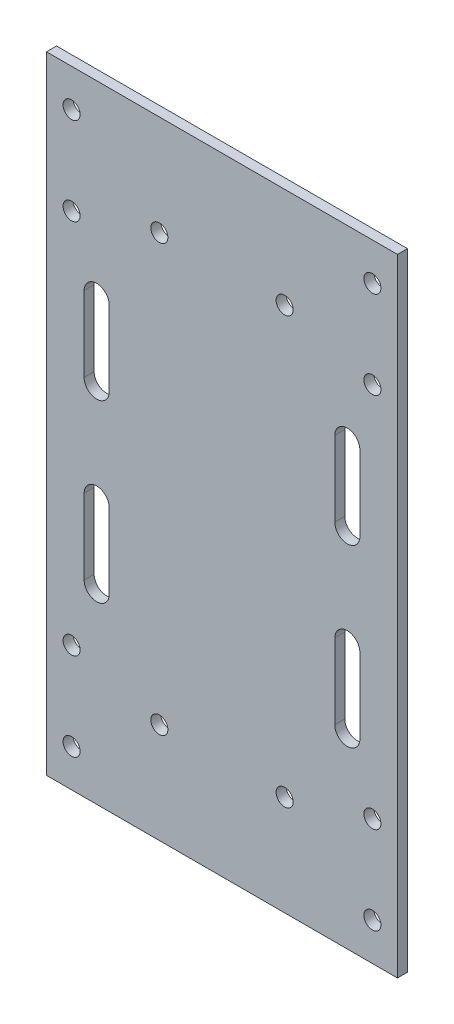
ISO-10303-21;
HEADER;
FILE_DESCRIPTION(('STEP AP214'),'2;1');
FILE_NAME('part.step','',(''),(''),'','','');
FILE_SCHEMA(('AUTOMOTIVE_DESIGN { 1 0 10303 214 1 1 1 1 }'));
ENDSEC;
DATA;
#1=APPLICATION_CONTEXT('core data for automotive mechanical design processes');
#2=APPLICATION_PROTOCOL_DEFINITION('international standard','automotive_design',2000,#1);
#3=PRODUCT_CONTEXT('',#1,'mechanical');
#4=PRODUCT('Part','Part','',(#3));
#5=PRODUCT_RELATED_PRODUCT_CATEGORY('part','',(#4));
#6=PRODUCT_DEFINITION_FORMATION('','',#4);
#7=PRODUCT_DEFINITION_CONTEXT('part definition',#1,'design');
#8=PRODUCT_DEFINITION('design','',#6,#7);
#9=PRODUCT_DEFINITION_SHAPE('','',#8);
#10=(LENGTH_UNIT() NAMED_UNIT(*) SI_UNIT(.MILLI.,.METRE.));
#11=(NAMED_UNIT(*) PLANE_ANGLE_UNIT() SI_UNIT($,.RADIAN.));
#12=(NAMED_UNIT(*) SI_UNIT($,.STERADIAN.) SOLID_ANGLE_UNIT());
#13=UNCERTAINTY_MEASURE_WITH_UNIT(LENGTH_MEASURE(1.E-05),#10,'distance_accuracy_value','');
#14=(GEOMETRIC_REPRESENTATION_CONTEXT(3) GLOBAL_UNCERTAINTY_ASSIGNED_CONTEXT((#13)) GLOBAL_UNIT_ASSIGNED_CONTEXT((#10,
#11,#12)) REPRESENTATION_CONTEXT('',''));
#15=CARTESIAN_POINT('',(0.,0.,0.));
#16=DIRECTION('',(0.,0.,1.));
#17=DIRECTION('',(1.,0.,0.));
#18=AXIS2_PLACEMENT_3D('',#15,#16,#17);
#19=CARTESIAN_POINT('',(0.,0.,0.));
#20=DIRECTION('',(0.,0.,-1.));
#21=DIRECTION('',(-1.,0.,0.));
#22=AXIS2_PLACEMENT_3D('',#19,#20,#21);
#23=PLANE('',#22);
#24=CARTESIAN_POINT('',(25.,-25.,0.));
#25=DIRECTION('',(0.,0.,-1.));
#26=DIRECTION('',(-1.,0.,0.));
#27=AXIS2_PLACEMENT_3D('',#24,#25,#26);
#28=CIRCLE('',#27,2.5);
#29=CARTESIAN_POINT('',(22.5,-25.,0.));
#30=VERTEX_POINT('',#29);
#31=CARTESIAN_POINT('',(27.5,-25.,0.));
#32=VERTEX_POINT('',#31);
#33=EDGE_CURVE('E557',#30,#32,#28,.F.);
#34=ORIENTED_EDGE('',*,*,#33,.F.);
#35=DIRECTION('',(0.,-1.,0.));
#36=VECTOR('',#35,1.);
#37=CARTESIAN_POINT('',(22.5,0.,0.));
#38=LINE('',#37,#36);
#39=CARTESIAN_POINT('',(22.5,-10.,0.));
#40=VERTEX_POINT('',#39);
#41=EDGE_CURVE('E261',#40,#30,#38,.T.);
#42=ORIENTED_EDGE('',*,*,#41,.F.);
#43=CARTESIAN_POINT('',(25.,-10.,0.));
#44=DIRECTION('',(0.,0.,-1.));
#45=DIRECTION('',(-1.,0.,0.));
#46=AXIS2_PLACEMENT_3D('',#43,#44,#45);
#47=CIRCLE('',#46,2.5);
#48=CARTESIAN_POINT('',(27.5,-10.,0.));
#49=VERTEX_POINT('',#48);
#50=EDGE_CURVE('E564',#49,#40,#47,.F.);
#51=ORIENTED_EDGE('',*,*,#50,.F.);
#52=DIRECTION('',(0.,1.,0.));
#53=VECTOR('',#52,1.);
#54=CARTESIAN_POINT('',(27.5,0.,0.));
#55=LINE('',#54,#53);
#56=EDGE_CURVE('E263',#32,#49,#55,.T.);
#57=ORIENTED_EDGE('',*,*,#56,.F.);
#58=EDGE_LOOP('',(#34,#42,#51,#57));
#59=FACE_BOUND('',#58,.T.);
#60=CARTESIAN_POINT('',(-25.,25.,0.));
#61=DIRECTION('',(0.,0.,-1.));
#62=DIRECTION('',(-1.,0.,0.));
#63=AXIS2_PLACEMENT_3D('',#60,#61,#62);
#64=CIRCLE('',#63,2.5);
#65=CARTESIAN_POINT('',(-22.5,25.,0.));
#66=VERTEX_POINT('',#65);
#67=CARTESIAN_POINT('',(-27.5,25.,0.));
#68=VERTEX_POINT('',#67);
#69=EDGE_CURVE('E566',#66,#68,#64,.F.);
#70=ORIENTED_EDGE('',*,*,#69,.F.);
#71=DIRECTION('',(0.,1.,0.));
#72=VECTOR('',#71,1.);
#73=CARTESIAN_POINT('',(-22.5,0.,0.));
#74=LINE('',#73,#72);
#75=CARTESIAN_POINT('',(-22.5,10.,0.));
#76=VERTEX_POINT('',#75);
#77=EDGE_CURVE('E268',#76,#66,#74,.T.);
#78=ORIENTED_EDGE('',*,*,#77,.F.);
#79=CARTESIAN_POINT('',(-25.,10.,0.));
#80=DIRECTION('',(0.,0.,-1.));
#81=DIRECTION('',(-1.,0.,0.));
#82=AXIS2_PLACEMENT_3D('',#79,#80,#81);
#83=CIRCLE('',#82,2.5);
#84=CARTESIAN_POINT('',(-27.5,10.,0.));
#85=VERTEX_POINT('',#84);
#86=EDGE_CURVE('E195',#85,#76,#83,.F.);
#87=ORIENTED_EDGE('',*,*,#86,.F.);
#88=DIRECTION('',(0.,-1.,0.));
#89=VECTOR('',#88,1.);
#90=CARTESIAN_POINT('',(-27.5,0.,0.));
#91=LINE('',#90,#89);
#92=EDGE_CURVE('E269',#68,#85,#91,.T.);
#93=ORIENTED_EDGE('',*,*,#92,.F.);
#94=EDGE_LOOP('',(#70,#78,#87,#93));
#95=FACE_BOUND('',#94,.T.);
#96=CARTESIAN_POINT('',(-25.,-10.,0.));
#97=DIRECTION('',(0.,0.,-1.));
#98=DIRECTION('',(-1.,0.,0.));
#99=AXIS2_PLACEMENT_3D('',#96,#97,#98);
#100=CIRCLE('',#99,2.5);
#101=CARTESIAN_POINT('',(-22.5,-10.,0.));
#102=VERTEX_POINT('',#101);
#103=CARTESIAN_POINT('',(-27.5,-10.,0.));
#104=VERTEX_POINT('',#103);
#105=EDGE_CURVE('E579',#102,#104,#100,.F.);
#106=ORIENTED_EDGE('',*,*,#105,.F.);
#107=DIRECTION('',(0.,1.,0.));
#108=VECTOR('',#107,1.);
#109=CARTESIAN_POINT('',(-22.5,0.,0.));
#110=LINE('',#109,#108);
#111=CARTESIAN_POINT('',(-22.5,-25.,0.));
#112=VERTEX_POINT('',#111);
#113=EDGE_CURVE('E255',#112,#102,#110,.T.);
#114=ORIENTED_EDGE('',*,*,#113,.F.);
#115=CARTESIAN_POINT('',(-25.,-25.,0.));
#116=DIRECTION('',(0.,0.,-1.));
#117=DIRECTION('',(-1.,0.,0.));
#118=AXIS2_PLACEMENT_3D('',#115,#116,#117);
#119=CIRCLE('',#118,2.5);
#120=CARTESIAN_POINT('',(-27.5,-25.,0.));
#121=VERTEX_POINT('',#120);
#122=EDGE_CURVE('E577',#121,#112,#119,.F.);
#123=ORIENTED_EDGE('',*,*,#122,.F.);
#124=DIRECTION('',(0.,-1.,0.));
#125=VECTOR('',#124,1.);
#126=CARTESIAN_POINT('',(-27.5,0.,0.));
#127=LINE('',#126,#125);
#128=EDGE_CURVE('E248',#104,#121,#127,.T.);
#129=ORIENTED_EDGE('',*,*,#128,.F.);
#130=EDGE_LOOP('',(#106,#114,#123,#129));
#131=FACE_BOUND('',#130,.T.);
#132=CARTESIAN_POINT('',(25.,10.,0.));
#133=DIRECTION('',(0.,0.,-1.));
#134=DIRECTION('',(-1.,0.,0.));
#135=AXIS2_PLACEMENT_3D('',#132,#133,#134);
#136=CIRCLE('',#135,2.5);
#137=CARTESIAN_POINT('',(22.5,10.,0.));
#138=VERTEX_POINT('',#137);
#139=CARTESIAN_POINT('',(27.5,10.,0.));
#140=VERTEX_POINT('',#139);
#141=EDGE_CURVE('E568',#138,#140,#136,.F.);
#142=ORIENTED_EDGE('',*,*,#141,.F.);
#143=DIRECTION('',(0.,-1.,0.));
#144=VECTOR('',#143,1.);
#145=CARTESIAN_POINT('',(22.5,0.,0.));
#146=LINE('',#145,#144);
#147=CARTESIAN_POINT('',(22.5,25.,0.));
#148=VERTEX_POINT('',#147);
#149=EDGE_CURVE('E253',#148,#138,#146,.T.);
#150=ORIENTED_EDGE('',*,*,#149,.F.);
#151=CARTESIAN_POINT('',(25.,25.,0.));
#152=DIRECTION('',(0.,0.,-1.));
#153=DIRECTION('',(-1.,0.,0.));
#154=AXIS2_PLACEMENT_3D('',#151,#152,#153);
#155=CIRCLE('',#154,2.5);
#156=CARTESIAN_POINT('',(27.5,25.,0.));
#157=VERTEX_POINT('',#156);
#158=EDGE_CURVE('E573',#157,#148,#155,.F.);
#159=ORIENTED_EDGE('',*,*,#158,.F.);
#160=DIRECTION('',(0.,1.,0.));
#161=VECTOR('',#160,1.);
#162=CARTESIAN_POINT('',(27.5,0.,0.));
#163=LINE('',#162,#161);
#164=EDGE_CURVE('E259',#140,#157,#163,.T.);
#165=ORIENTED_EDGE('',*,*,#164,.F.);
#166=EDGE_LOOP('',(#142,#150,#159,#165));
#167=FACE_BOUND('',#166,.T.);
#168=DIRECTION('',(0.,1.,0.));
#169=VECTOR('',#168,1.);
#170=CARTESIAN_POINT('',(35.,-62.5,0.));
#171=LINE('',#170,#169);
#172=CARTESIAN_POINT('',(35.,-62.5,0.));
#173=VERTEX_POINT('',#172);
#174=CARTESIAN_POINT('',(35.,62.5,0.));
#175=VERTEX_POINT('',#174);
#176=EDGE_CURVE('E962',#173,#175,#171,.T.);
#177=ORIENTED_EDGE('',*,*,#176,.T.);
#178=DIRECTION('',(-1.,0.,0.));
#179=VECTOR('',#178,1.);
#180=CARTESIAN_POINT('',(-35.,62.5,0.));
#181=LINE('',#180,#179);
#182=CARTESIAN_POINT('',(-35.,62.5,0.));
#183=VERTEX_POINT('',#182);
#184=EDGE_CURVE('E967',#175,#183,#181,.T.);
#185=ORIENTED_EDGE('',*,*,#184,.T.);
#186=DIRECTION('',(0.,-1.,0.));
#187=VECTOR('',#186,1.);
#188=CARTESIAN_POINT('',(-35.,-62.5,0.));
#189=LINE('',#188,#187);
#190=CARTESIAN_POINT('',(-35.,-62.5,0.));
#191=VERTEX_POINT('',#190);
#192=EDGE_CURVE('E968',#183,#191,#189,.T.);
#193=ORIENTED_EDGE('',*,*,#192,.T.);
#194=DIRECTION('',(1.,0.,0.));
#195=VECTOR('',#194,1.);
#196=CARTESIAN_POINT('',(-35.,-62.5,0.));
#197=LINE('',#196,#195);
#198=EDGE_CURVE('E969',#191,#173,#197,.T.);
#199=ORIENTED_EDGE('',*,*,#198,.T.);
#200=EDGE_LOOP('',(#177,#185,#193,#199));
#201=FACE_BOUND('',#200,.T.);
#202=CARTESIAN_POINT('',(-30.,-55.,1.2E-05));
#203=DIRECTION('',(0.,0.,1.));
#204=DIRECTION('',(1.,0.,0.));
#205=AXIS2_PLACEMENT_3D('',#202,#203,#204);
#206=CIRCLE('',#205,1.7);
#207=CARTESIAN_POINT('',(-28.3,-55.,1.2E-05));
#208=VERTEX_POINT('',#207);
#209=EDGE_CURVE('E316',#208,#208,#206,.T.);
#210=ORIENTED_EDGE('',*,*,#209,.F.);
#211=EDGE_LOOP('',(#210));
#212=FACE_BOUND('',#211,.T.);
#213=CARTESIAN_POINT('',(-12.5,42.5,1.2E-05));
#214=DIRECTION('',(0.,0.,1.));
#215=DIRECTION('',(1.,0.,0.));
#216=AXIS2_PLACEMENT_3D('',#213,#214,#215);
#217=CIRCLE('',#216,1.7);
#218=CARTESIAN_POINT('',(-10.8,42.5,1.2E-05));
#219=VERTEX_POINT('',#218);
#220=EDGE_CURVE('E281',#219,#219,#217,.T.);
#221=ORIENTED_EDGE('',*,*,#220,.F.);
#222=EDGE_LOOP('',(#221));
#223=FACE_BOUND('',#222,.T.);
#224=CARTESIAN_POINT('',(12.5,-42.5,1.2E-05));
#225=DIRECTION('',(0.,0.,1.));
#226=DIRECTION('',(1.,0.,0.));
#227=AXIS2_PLACEMENT_3D('',#224,#225,#226);
#228=CIRCLE('',#227,1.7);
#229=CARTESIAN_POINT('',(14.2,-42.5,1.2E-05));
#230=VERTEX_POINT('',#229);
#231=EDGE_CURVE('E277',#230,#230,#228,.T.);
#232=ORIENTED_EDGE('',*,*,#231,.F.);
#233=EDGE_LOOP('',(#232));
#234=FACE_BOUND('',#233,.T.);
#235=CARTESIAN_POINT('',(12.5,42.5,1.2E-05));
#236=DIRECTION('',(0.,0.,1.));
#237=DIRECTION('',(1.,0.,0.));
#238=AXIS2_PLACEMENT_3D('',#235,#236,#237);
#239=CIRCLE('',#238,1.7);
#240=CARTESIAN_POINT('',(14.2,42.5,1.2E-05));
#241=VERTEX_POINT('',#240);
#242=EDGE_CURVE('E275',#241,#241,#239,.T.);
#243=ORIENTED_EDGE('',*,*,#242,.F.);
#244=EDGE_LOOP('',(#243));
#245=FACE_BOUND('',#244,.T.);
#246=CARTESIAN_POINT('',(30.,-55.,1.2E-05));
#247=DIRECTION('',(0.,0.,1.));
#248=DIRECTION('',(1.,0.,0.));
#249=AXIS2_PLACEMENT_3D('',#246,#247,#248);
#250=CIRCLE('',#249,1.7);
#251=CARTESIAN_POINT('',(31.7,-55.,1.2E-05));
#252=VERTEX_POINT('',#251);
#253=EDGE_CURVE('E298',#252,#252,#250,.T.);
#254=ORIENTED_EDGE('',*,*,#253,.F.);
#255=EDGE_LOOP('',(#254));
#256=FACE_BOUND('',#255,.T.);
#257=CARTESIAN_POINT('',(-30.,55.,1.2E-05));
#258=DIRECTION('',(0.,0.,1.));
#259=DIRECTION('',(1.,0.,0.));
#260=AXIS2_PLACEMENT_3D('',#257,#258,#259);
#261=CIRCLE('',#260,1.7);
#262=CARTESIAN_POINT('',(-28.3,55.,1.2E-05));
#263=VERTEX_POINT('',#262);
#264=EDGE_CURVE('E304',#263,#263,#261,.T.);
#265=ORIENTED_EDGE('',*,*,#264,.F.);
#266=EDGE_LOOP('',(#265));
#267=FACE_BOUND('',#266,.T.);
#268=CARTESIAN_POINT('',(-30.,37.5,1.2E-05));
#269=DIRECTION('',(0.,0.,1.));
#270=DIRECTION('',(1.,0.,0.));
#271=AXIS2_PLACEMENT_3D('',#268,#269,#270);
#272=CIRCLE('',#271,1.7);
#273=CARTESIAN_POINT('',(-28.3,37.5,1.2E-05));
#274=VERTEX_POINT('',#273);
#275=EDGE_CURVE('E302',#274,#274,#272,.T.);
#276=ORIENTED_EDGE('',*,*,#275,.F.);
#277=EDGE_LOOP('',(#276));
#278=FACE_BOUND('',#277,.T.);
#279=CARTESIAN_POINT('',(-30.,-37.5,1.2E-05));
#280=DIRECTION('',(0.,0.,1.));
#281=DIRECTION('',(1.,0.,0.));
#282=AXIS2_PLACEMENT_3D('',#279,#280,#281);
#283=CIRCLE('',#282,1.7);
#284=CARTESIAN_POINT('',(-28.3,-37.5,1.2E-05));
#285=VERTEX_POINT('',#284);
#286=EDGE_CURVE('E312',#285,#285,#283,.T.);
#287=ORIENTED_EDGE('',*,*,#286,.F.);
#288=EDGE_LOOP('',(#287));
#289=FACE_BOUND('',#288,.T.);
#290=CARTESIAN_POINT('',(-12.5,-42.5,1.2E-05));
#291=DIRECTION('',(0.,0.,1.));
#292=DIRECTION('',(1.,0.,0.));
#293=AXIS2_PLACEMENT_3D('',#290,#291,#292);
#294=CIRCLE('',#293,1.7);
#295=CARTESIAN_POINT('',(-10.8,-42.5,1.2E-05));
#296=VERTEX_POINT('',#295);
#297=EDGE_CURVE('E278',#296,#296,#294,.T.);
#298=ORIENTED_EDGE('',*,*,#297,.F.);
#299=EDGE_LOOP('',(#298));
#300=FACE_BOUND('',#299,.T.);
#301=CARTESIAN_POINT('',(30.,55.,1.2E-05));
#302=DIRECTION('',(0.,0.,1.));
#303=DIRECTION('',(1.,0.,0.));
#304=AXIS2_PLACEMENT_3D('',#301,#302,#303);
#305=CIRCLE('',#304,1.7);
#306=CARTESIAN_POINT('',(31.7,55.,1.2E-05));
#307=VERTEX_POINT('',#306);
#308=EDGE_CURVE('E286',#307,#307,#305,.T.);
#309=ORIENTED_EDGE('',*,*,#308,.F.);
#310=EDGE_LOOP('',(#309));
#311=FACE_BOUND('',#310,.T.);
#312=CARTESIAN_POINT('',(30.,37.5,1.2E-05));
#313=DIRECTION('',(0.,0.,1.));
#314=DIRECTION('',(1.,0.,0.));
#315=AXIS2_PLACEMENT_3D('',#312,#313,#314);
#316=CIRCLE('',#315,1.7);
#317=CARTESIAN_POINT('',(31.7,37.5,1.2E-05));
#318=VERTEX_POINT('',#317);
#319=EDGE_CURVE('E290',#318,#318,#316,.T.);
#320=ORIENTED_EDGE('',*,*,#319,.F.);
#321=EDGE_LOOP('',(#320));
#322=FACE_BOUND('',#321,.T.);
#323=CARTESIAN_POINT('',(30.,-37.5,1.2E-05));
#324=DIRECTION('',(0.,0.,1.));
#325=DIRECTION('',(1.,0.,0.));
#326=AXIS2_PLACEMENT_3D('',#323,#324,#325);
#327=CIRCLE('',#326,1.7);
#328=CARTESIAN_POINT('',(31.7,-37.5,1.2E-05));
#329=VERTEX_POINT('',#328);
#330=EDGE_CURVE('E300',#329,#329,#327,.T.);
#331=ORIENTED_EDGE('',*,*,#330,.F.);
#332=EDGE_LOOP('',(#331));
#333=FACE_BOUND('',#332,.T.);
#334=ADVANCED_FACE('F39',(#59,#95,#131,#167,#201,#212,#223,#234,#245,#256,#267,#278,#289,#300,
#311,#322,#333),#23,.F.);
#335=CARTESIAN_POINT('',(0.,0.,-2.));
#336=DIRECTION('',(0.,0.,-1.));
#337=DIRECTION('',(-1.,0.,0.));
#338=AXIS2_PLACEMENT_3D('',#335,#336,#337);
#339=PLANE('',#338);
#340=CARTESIAN_POINT('',(30.,-37.5,-2.));
#341=DIRECTION('',(0.,0.,1.));
#342=DIRECTION('',(1.,0.,0.));
#343=AXIS2_PLACEMENT_3D('',#340,#341,#342);
#344=CIRCLE('',#343,1.7);
#345=CARTESIAN_POINT('',(31.7,-37.5,-2.));
#346=VERTEX_POINT('',#345);
#347=EDGE_CURVE('E291',#346,#346,#344,.T.);
#348=ORIENTED_EDGE('',*,*,#347,.T.);
#349=EDGE_LOOP('',(#348));
#350=FACE_BOUND('',#349,.T.);
#351=CARTESIAN_POINT('',(30.,37.5,-2.));
#352=DIRECTION('',(0.,0.,1.));
#353=DIRECTION('',(1.,0.,0.));
#354=AXIS2_PLACEMENT_3D('',#351,#352,#353);
#355=CIRCLE('',#354,1.7);
#356=CARTESIAN_POINT('',(31.7,37.5,-2.));
#357=VERTEX_POINT('',#356);
#358=EDGE_CURVE('E296',#357,#357,#355,.T.);
#359=ORIENTED_EDGE('',*,*,#358,.T.);
#360=EDGE_LOOP('',(#359));
#361=FACE_BOUND('',#360,.T.);
#362=CARTESIAN_POINT('',(30.,55.,-2.));
#363=DIRECTION('',(0.,0.,1.));
#364=DIRECTION('',(1.,0.,0.));
#365=AXIS2_PLACEMENT_3D('',#362,#363,#364);
#366=CIRCLE('',#365,1.7);
#367=CARTESIAN_POINT('',(31.7,55.,-2.));
#368=VERTEX_POINT('',#367);
#369=EDGE_CURVE('E285',#368,#368,#366,.T.);
#370=ORIENTED_EDGE('',*,*,#369,.T.);
#371=EDGE_LOOP('',(#370));
#372=FACE_BOUND('',#371,.T.);
#373=CARTESIAN_POINT('',(-12.5,-42.5,-2.));
#374=DIRECTION('',(0.,0.,1.));
#375=DIRECTION('',(1.,0.,0.));
#376=AXIS2_PLACEMENT_3D('',#373,#374,#375);
#377=CIRCLE('',#376,1.7);
#378=CARTESIAN_POINT('',(-10.8,-42.5,-2.));
#379=VERTEX_POINT('',#378);
#380=EDGE_CURVE('E288',#379,#379,#377,.T.);
#381=ORIENTED_EDGE('',*,*,#380,.T.);
#382=EDGE_LOOP('',(#381));
#383=FACE_BOUND('',#382,.T.);
#384=CARTESIAN_POINT('',(-30.,-37.5,-2.));
#385=DIRECTION('',(0.,0.,1.));
#386=DIRECTION('',(1.,0.,0.));
#387=AXIS2_PLACEMENT_3D('',#384,#385,#386);
#388=CIRCLE('',#387,1.7);
#389=CARTESIAN_POINT('',(-28.3,-37.5,-2.));
#390=VERTEX_POINT('',#389);
#391=EDGE_CURVE('E307',#390,#390,#388,.T.);
#392=ORIENTED_EDGE('',*,*,#391,.T.);
#393=EDGE_LOOP('',(#392));
#394=FACE_BOUND('',#393,.T.);
#395=CARTESIAN_POINT('',(-30.,37.5,-2.));
#396=DIRECTION('',(0.,0.,1.));
#397=DIRECTION('',(1.,0.,0.));
#398=AXIS2_PLACEMENT_3D('',#395,#396,#397);
#399=CIRCLE('',#398,1.7);
#400=CARTESIAN_POINT('',(-28.3,37.5,-2.));
#401=VERTEX_POINT('',#400);
#402=EDGE_CURVE('E313',#401,#401,#399,.T.);
#403=ORIENTED_EDGE('',*,*,#402,.T.);
#404=EDGE_LOOP('',(#403));
#405=FACE_BOUND('',#404,.T.);
#406=CARTESIAN_POINT('',(-30.,55.,-2.));
#407=DIRECTION('',(0.,0.,1.));
#408=DIRECTION('',(1.,0.,0.));
#409=AXIS2_PLACEMENT_3D('',#406,#407,#408);
#410=CIRCLE('',#409,1.7);
#411=CARTESIAN_POINT('',(-28.3,55.,-2.));
#412=VERTEX_POINT('',#411);
#413=EDGE_CURVE('E301',#412,#412,#410,.T.);
#414=ORIENTED_EDGE('',*,*,#413,.T.);
#415=EDGE_LOOP('',(#414));
#416=FACE_BOUND('',#415,.T.);
#417=CARTESIAN_POINT('',(30.,-55.,-2.));
#418=DIRECTION('',(0.,0.,1.));
#419=DIRECTION('',(1.,0.,0.));
#420=AXIS2_PLACEMENT_3D('',#417,#418,#419);
#421=CIRCLE('',#420,1.7);
#422=CARTESIAN_POINT('',(31.7,-55.,-2.));
#423=VERTEX_POINT('',#422);
#424=EDGE_CURVE('E306',#423,#423,#421,.T.);
#425=ORIENTED_EDGE('',*,*,#424,.T.);
#426=EDGE_LOOP('',(#425));
#427=FACE_BOUND('',#426,.T.);
#428=CARTESIAN_POINT('',(12.5,42.5,-2.));
#429=DIRECTION('',(0.,0.,1.));
#430=DIRECTION('',(1.,0.,0.));
#431=AXIS2_PLACEMENT_3D('',#428,#429,#430);
#432=CIRCLE('',#431,1.7);
#433=CARTESIAN_POINT('',(14.2,42.5,-2.));
#434=VERTEX_POINT('',#433);
#435=EDGE_CURVE('E271',#434,#434,#432,.T.);
#436=ORIENTED_EDGE('',*,*,#435,.T.);
#437=EDGE_LOOP('',(#436));
#438=FACE_BOUND('',#437,.T.);
#439=CARTESIAN_POINT('',(12.5,-42.5,-2.));
#440=DIRECTION('',(0.,0.,1.));
#441=DIRECTION('',(1.,0.,0.));
#442=AXIS2_PLACEMENT_3D('',#439,#440,#441);
#443=CIRCLE('',#442,1.7);
#444=CARTESIAN_POINT('',(14.2,-42.5,-2.));
#445=VERTEX_POINT('',#444);
#446=EDGE_CURVE('E282',#445,#445,#443,.T.);
#447=ORIENTED_EDGE('',*,*,#446,.T.);
#448=EDGE_LOOP('',(#447));
#449=FACE_BOUND('',#448,.T.);
#450=CARTESIAN_POINT('',(-12.5,42.5,-2.));
#451=DIRECTION('',(0.,0.,1.));
#452=DIRECTION('',(1.,0.,0.));
#453=AXIS2_PLACEMENT_3D('',#450,#451,#452);
#454=CIRCLE('',#453,1.7);
#455=CARTESIAN_POINT('',(-10.8,42.5,-2.));
#456=VERTEX_POINT('',#455);
#457=EDGE_CURVE('E280',#456,#456,#454,.T.);
#458=ORIENTED_EDGE('',*,*,#457,.T.);
#459=EDGE_LOOP('',(#458));
#460=FACE_BOUND('',#459,.T.);
#461=CARTESIAN_POINT('',(-30.,-55.,-2.));
#462=DIRECTION('',(0.,0.,1.));
#463=DIRECTION('',(1.,0.,0.));
#464=AXIS2_PLACEMENT_3D('',#461,#462,#463);
#465=CIRCLE('',#464,1.7);
#466=CARTESIAN_POINT('',(-28.3,-55.,-2.));
#467=VERTEX_POINT('',#466);
#468=EDGE_CURVE('E315',#467,#467,#465,.T.);
#469=ORIENTED_EDGE('',*,*,#468,.T.);
#470=EDGE_LOOP('',(#469));
#471=FACE_BOUND('',#470,.T.);
#472=DIRECTION('',(0.,1.,0.));
#473=VECTOR('',#472,1.);
#474=CARTESIAN_POINT('',(35.,-62.5,-2.));
#475=LINE('',#474,#473);
#476=CARTESIAN_POINT('',(35.,-62.5,-2.));
#477=VERTEX_POINT('',#476);
#478=CARTESIAN_POINT('',(35.,62.5,-2.));
#479=VERTEX_POINT('',#478);
#480=EDGE_CURVE('E416',#477,#479,#475,.T.);
#481=ORIENTED_EDGE('',*,*,#480,.F.);
#482=DIRECTION('',(1.,0.,0.));
#483=VECTOR('',#482,1.);
#484=CARTESIAN_POINT('',(-35.,-62.5,-2.));
#485=LINE('',#484,#483);
#486=CARTESIAN_POINT('',(-35.,-62.5,-2.));
#487=VERTEX_POINT('',#486);
#488=EDGE_CURVE('E978',#487,#477,#485,.T.);
#489=ORIENTED_EDGE('',*,*,#488,.F.);
#490=DIRECTION('',(0.,-1.,0.));
#491=VECTOR('',#490,1.);
#492=CARTESIAN_POINT('',(-35.,-62.5,-2.));
#493=LINE('',#492,#491);
#494=CARTESIAN_POINT('',(-35.,62.5,-2.));
#495=VERTEX_POINT('',#494);
#496=EDGE_CURVE('E986',#495,#487,#493,.T.);
#497=ORIENTED_EDGE('',*,*,#496,.F.);
#498=DIRECTION('',(-1.,0.,0.));
#499=VECTOR('',#498,1.);
#500=CARTESIAN_POINT('',(-35.,62.5,-2.));
#501=LINE('',#500,#499);
#502=EDGE_CURVE('E975',#479,#495,#501,.T.);
#503=ORIENTED_EDGE('',*,*,#502,.F.);
#504=EDGE_LOOP('',(#481,#489,#497,#503));
#505=FACE_BOUND('',#504,.T.);
#506=DIRECTION('',(0.,1.,0.));
#507=VECTOR('',#506,1.);
#508=CARTESIAN_POINT('',(-22.5,-25.,-2.));
#509=LINE('',#508,#507);
#510=CARTESIAN_POINT('',(-22.5,-25.,-2.));
#511=VERTEX_POINT('',#510);
#512=CARTESIAN_POINT('',(-22.5,-10.,-2.));
#513=VERTEX_POINT('',#512);
#514=EDGE_CURVE('E214',#511,#513,#509,.T.);
#515=ORIENTED_EDGE('',*,*,#514,.T.);
#516=CARTESIAN_POINT('',(-25.,-10.,-2.));
#517=DIRECTION('',(0.,0.,1.));
#518=DIRECTION('',(1.,0.,0.));
#519=AXIS2_PLACEMENT_3D('',#516,#517,#518);
#520=CIRCLE('',#519,2.5);
#521=CARTESIAN_POINT('',(-27.5,-10.,-2.));
#522=VERTEX_POINT('',#521);
#523=EDGE_CURVE('E210',#513,#522,#520,.T.);
#524=ORIENTED_EDGE('',*,*,#523,.T.);
#525=DIRECTION('',(0.,-1.,0.));
#526=VECTOR('',#525,1.);
#527=CARTESIAN_POINT('',(-27.5,-25.,-2.));
#528=LINE('',#527,#526);
#529=CARTESIAN_POINT('',(-27.5,-25.,-2.));
#530=VERTEX_POINT('',#529);
#531=EDGE_CURVE('E216',#522,#530,#528,.T.);
#532=ORIENTED_EDGE('',*,*,#531,.T.);
#533=CARTESIAN_POINT('',(-25.,-25.,-2.));
#534=DIRECTION('',(0.,0.,1.));
#535=DIRECTION('',(1.,0.,0.));
#536=AXIS2_PLACEMENT_3D('',#533,#534,#535);
#537=CIRCLE('',#536,2.5);
#538=EDGE_CURVE('E605',#530,#511,#537,.T.);
#539=ORIENTED_EDGE('',*,*,#538,.T.);
#540=EDGE_LOOP('',(#515,#524,#532,#539));
#541=FACE_BOUND('',#540,.T.);
#542=DIRECTION('',(0.,-1.,0.));
#543=VECTOR('',#542,1.);
#544=CARTESIAN_POINT('',(22.5,10.,-2.));
#545=LINE('',#544,#543);
#546=CARTESIAN_POINT('',(22.5,25.,-2.));
#547=VERTEX_POINT('',#546);
#548=CARTESIAN_POINT('',(22.5,10.,-2.));
#549=VERTEX_POINT('',#548);
#550=EDGE_CURVE('E547',#547,#549,#545,.T.);
#551=ORIENTED_EDGE('',*,*,#550,.T.);
#552=CARTESIAN_POINT('',(25.,10.,-2.));
#553=DIRECTION('',(0.,0.,1.));
#554=DIRECTION('',(1.,0.,0.));
#555=AXIS2_PLACEMENT_3D('',#552,#553,#554);
#556=CIRCLE('',#555,2.5);
#557=CARTESIAN_POINT('',(27.5,10.,-2.));
#558=VERTEX_POINT('',#557);
#559=EDGE_CURVE('E610',#549,#558,#556,.T.);
#560=ORIENTED_EDGE('',*,*,#559,.T.);
#561=DIRECTION('',(0.,1.,0.));
#562=VECTOR('',#561,1.);
#563=CARTESIAN_POINT('',(27.5,10.,-2.));
#564=LINE('',#563,#562);
#565=CARTESIAN_POINT('',(27.5,25.,-2.));
#566=VERTEX_POINT('',#565);
#567=EDGE_CURVE('E221',#558,#566,#564,.T.);
#568=ORIENTED_EDGE('',*,*,#567,.T.);
#569=CARTESIAN_POINT('',(25.,25.,-2.));
#570=DIRECTION('',(0.,0.,1.));
#571=DIRECTION('',(1.,0.,0.));
#572=AXIS2_PLACEMENT_3D('',#569,#570,#571);
#573=CIRCLE('',#572,2.5);
#574=EDGE_CURVE('E609',#566,#547,#573,.T.);
#575=ORIENTED_EDGE('',*,*,#574,.T.);
#576=EDGE_LOOP('',(#551,#560,#568,#575));
#577=FACE_BOUND('',#576,.T.);
#578=DIRECTION('',(0.,-1.,0.));
#579=VECTOR('',#578,1.);
#580=CARTESIAN_POINT('',(22.5,-25.,-2.));
#581=LINE('',#580,#579);
#582=CARTESIAN_POINT('',(22.5,-10.,-2.));
#583=VERTEX_POINT('',#582);
#584=CARTESIAN_POINT('',(22.5,-25.,-2.));
#585=VERTEX_POINT('',#584);
#586=EDGE_CURVE('E233',#583,#585,#581,.T.);
#587=ORIENTED_EDGE('',*,*,#586,.T.);
#588=CARTESIAN_POINT('',(25.,-25.,-2.));
#589=DIRECTION('',(0.,0.,1.));
#590=DIRECTION('',(1.,0.,0.));
#591=AXIS2_PLACEMENT_3D('',#588,#589,#590);
#592=CIRCLE('',#591,2.5);
#593=CARTESIAN_POINT('',(27.5,-25.,-2.));
#594=VERTEX_POINT('',#593);
#595=EDGE_CURVE('E548',#585,#594,#592,.T.);
#596=ORIENTED_EDGE('',*,*,#595,.T.);
#597=DIRECTION('',(0.,1.,0.));
#598=VECTOR('',#597,1.);
#599=CARTESIAN_POINT('',(27.5,-25.,-2.));
#600=LINE('',#599,#598);
#601=CARTESIAN_POINT('',(27.5,-10.,-2.));
#602=VERTEX_POINT('',#601);
#603=EDGE_CURVE('E234',#594,#602,#600,.T.);
#604=ORIENTED_EDGE('',*,*,#603,.T.);
#605=CARTESIAN_POINT('',(25.,-10.,-2.));
#606=DIRECTION('',(0.,0.,1.));
#607=DIRECTION('',(1.,0.,0.));
#608=AXIS2_PLACEMENT_3D('',#605,#606,#607);
#609=CIRCLE('',#608,2.5);
#610=EDGE_CURVE('E552',#602,#583,#609,.T.);
#611=ORIENTED_EDGE('',*,*,#610,.T.);
#612=EDGE_LOOP('',(#587,#596,#604,#611));
#613=FACE_BOUND('',#612,.T.);
#614=DIRECTION('',(0.,1.,0.));
#615=VECTOR('',#614,1.);
#616=CARTESIAN_POINT('',(-22.5,10.,-2.));
#617=LINE('',#616,#615);
#618=CARTESIAN_POINT('',(-22.5,10.,-2.));
#619=VERTEX_POINT('',#618);
#620=CARTESIAN_POINT('',(-22.5,25.,-2.));
#621=VERTEX_POINT('',#620);
#622=EDGE_CURVE('E203',#619,#621,#617,.T.);
#623=ORIENTED_EDGE('',*,*,#622,.T.);
#624=CARTESIAN_POINT('',(-25.,25.,-2.));
#625=DIRECTION('',(0.,0.,1.));
#626=DIRECTION('',(1.,0.,0.));
#627=AXIS2_PLACEMENT_3D('',#624,#625,#626);
#628=CIRCLE('',#627,2.5);
#629=CARTESIAN_POINT('',(-27.5,25.,-2.));
#630=VERTEX_POINT('',#629);
#631=EDGE_CURVE('E206',#621,#630,#628,.T.);
#632=ORIENTED_EDGE('',*,*,#631,.T.);
#633=DIRECTION('',(0.,-1.,0.));
#634=VECTOR('',#633,1.);
#635=CARTESIAN_POINT('',(-27.5,10.,-2.));
#636=LINE('',#635,#634);
#637=CARTESIAN_POINT('',(-27.5,10.,-2.));
#638=VERTEX_POINT('',#637);
#639=EDGE_CURVE('E197',#630,#638,#636,.T.);
#640=ORIENTED_EDGE('',*,*,#639,.T.);
#641=CARTESIAN_POINT('',(-25.,10.,-2.));
#642=DIRECTION('',(0.,0.,1.));
#643=DIRECTION('',(1.,0.,0.));
#644=AXIS2_PLACEMENT_3D('',#641,#642,#643);
#645=CIRCLE('',#644,2.5);
#646=EDGE_CURVE('E186',#638,#619,#645,.T.);
#647=ORIENTED_EDGE('',*,*,#646,.T.);
#648=EDGE_LOOP('',(#623,#632,#640,#647));
#649=FACE_BOUND('',#648,.T.);
#650=ADVANCED_FACE('F205',(#350,#361,#372,#383,#394,#405,#416,#427,#438,#449,#460,#471,#505,
#541,#577,#613,#649),#339,.T.);
#651=CARTESIAN_POINT('',(35.,-62.5,-2.));
#652=DIRECTION('',(1.,0.,0.));
#653=DIRECTION('',(0.,0.,-1.));
#654=AXIS2_PLACEMENT_3D('',#651,#652,#653);
#655=PLANE('',#654);
#656=ORIENTED_EDGE('',*,*,#176,.F.);
#657=DIRECTION('',(0.,0.,1.));
#658=VECTOR('',#657,1.);
#659=CARTESIAN_POINT('',(35.,-62.5,-2.));
#660=LINE('',#659,#658);
#661=EDGE_CURVE('E11',#477,#173,#660,.T.);
#662=ORIENTED_EDGE('',*,*,#661,.F.);
#663=ORIENTED_EDGE('',*,*,#480,.T.);
#664=DIRECTION('',(0.,0.,1.));
#665=VECTOR('',#664,1.);
#666=CARTESIAN_POINT('',(35.,62.5,-2.));
#667=LINE('',#666,#665);
#668=EDGE_CURVE('E86',#479,#175,#667,.T.);
#669=ORIENTED_EDGE('',*,*,#668,.T.);
#670=EDGE_LOOP('',(#656,#662,#663,#669));
#671=FACE_BOUND('',#670,.T.);
#672=ADVANCED_FACE('F41',(#671),#655,.T.);
#673=CARTESIAN_POINT('',(-35.,-62.5,-2.));
#674=DIRECTION('',(0.,-1.,0.));
#675=DIRECTION('',(0.,0.,-1.));
#676=AXIS2_PLACEMENT_3D('',#673,#674,#675);
#677=PLANE('',#676);
#678=ORIENTED_EDGE('',*,*,#198,.F.);
#679=DIRECTION('',(0.,0.,1.));
#680=VECTOR('',#679,1.);
#681=CARTESIAN_POINT('',(-35.,-62.5,-2.));
#682=LINE('',#681,#680);
#683=EDGE_CURVE('E51',#487,#191,#682,.T.);
#684=ORIENTED_EDGE('',*,*,#683,.F.);
#685=ORIENTED_EDGE('',*,*,#488,.T.);
#686=ORIENTED_EDGE('',*,*,#661,.T.);
#687=EDGE_LOOP('',(#678,#684,#685,#686));
#688=FACE_BOUND('',#687,.T.);
#689=ADVANCED_FACE('F441',(#688),#677,.T.);
#690=CARTESIAN_POINT('',(-35.,-62.5,-2.));
#691=DIRECTION('',(-1.,0.,0.));
#692=DIRECTION('',(0.,0.,1.));
#693=AXIS2_PLACEMENT_3D('',#690,#691,#692);
#694=PLANE('',#693);
#695=ORIENTED_EDGE('',*,*,#192,.F.);
#696=DIRECTION('',(0.,0.,1.));
#697=VECTOR('',#696,1.);
#698=CARTESIAN_POINT('',(-35.,62.5,-2.));
#699=LINE('',#698,#697);
#700=EDGE_CURVE('E977',#495,#183,#699,.T.);
#701=ORIENTED_EDGE('',*,*,#700,.F.);
#702=ORIENTED_EDGE('',*,*,#496,.T.);
#703=ORIENTED_EDGE('',*,*,#683,.T.);
#704=EDGE_LOOP('',(#695,#701,#702,#703));
#705=FACE_BOUND('',#704,.T.);
#706=ADVANCED_FACE('F931',(#705),#694,.T.);
#707=CARTESIAN_POINT('',(-35.,62.5,-2.));
#708=DIRECTION('',(0.,1.,0.));
#709=DIRECTION('',(0.,0.,1.));
#710=AXIS2_PLACEMENT_3D('',#707,#708,#709);
#711=PLANE('',#710);
#712=ORIENTED_EDGE('',*,*,#184,.F.);
#713=ORIENTED_EDGE('',*,*,#668,.F.);
#714=ORIENTED_EDGE('',*,*,#502,.T.);
#715=ORIENTED_EDGE('',*,*,#700,.T.);
#716=EDGE_LOOP('',(#712,#713,#714,#715));
#717=FACE_BOUND('',#716,.T.);
#718=ADVANCED_FACE('F431',(#717),#711,.T.);
#719=CARTESIAN_POINT('',(-30.,-55.,1.2E-05));
#720=DIRECTION('',(0.,0.,-1.));
#721=DIRECTION('',(-1.,0.,0.));
#722=AXIS2_PLACEMENT_3D('',#719,#720,#721);
#723=CYLINDRICAL_SURFACE('',#722,1.7);
#724=ORIENTED_EDGE('',*,*,#209,.T.);
#725=EDGE_LOOP('',(#724));
#726=FACE_BOUND('',#725,.T.);
#727=ORIENTED_EDGE('',*,*,#468,.F.);
#728=EDGE_LOOP('',(#727));
#729=FACE_BOUND('',#728,.T.);
#730=ADVANCED_FACE('F423',(#726,#729),#723,.F.);
#731=CARTESIAN_POINT('',(-12.5,42.5,1.2E-05));
#732=DIRECTION('',(0.,0.,-1.));
#733=DIRECTION('',(-1.,0.,0.));
#734=AXIS2_PLACEMENT_3D('',#731,#732,#733);
#735=CYLINDRICAL_SURFACE('',#734,1.7);
#736=ORIENTED_EDGE('',*,*,#220,.T.);
#737=EDGE_LOOP('',(#736));
#738=FACE_BOUND('',#737,.T.);
#739=ORIENTED_EDGE('',*,*,#457,.F.);
#740=EDGE_LOOP('',(#739));
#741=FACE_BOUND('',#740,.T.);
#742=ADVANCED_FACE('F384',(#738,#741),#735,.F.);
#743=CARTESIAN_POINT('',(12.5,-42.5,1.2E-05));
#744=DIRECTION('',(0.,0.,-1.));
#745=DIRECTION('',(-1.,0.,0.));
#746=AXIS2_PLACEMENT_3D('',#743,#744,#745);
#747=CYLINDRICAL_SURFACE('',#746,1.7);
#748=ORIENTED_EDGE('',*,*,#231,.T.);
#749=EDGE_LOOP('',(#748));
#750=FACE_BOUND('',#749,.T.);
#751=ORIENTED_EDGE('',*,*,#446,.F.);
#752=EDGE_LOOP('',(#751));
#753=FACE_BOUND('',#752,.T.);
#754=ADVANCED_FACE('F377',(#750,#753),#747,.F.);
#755=CARTESIAN_POINT('',(12.5,42.5,1.2E-05));
#756=DIRECTION('',(0.,0.,-1.));
#757=DIRECTION('',(-1.,0.,0.));
#758=AXIS2_PLACEMENT_3D('',#755,#756,#757);
#759=CYLINDRICAL_SURFACE('',#758,1.7);
#760=ORIENTED_EDGE('',*,*,#242,.T.);
#761=EDGE_LOOP('',(#760));
#762=FACE_BOUND('',#761,.T.);
#763=ORIENTED_EDGE('',*,*,#435,.F.);
#764=EDGE_LOOP('',(#763));
#765=FACE_BOUND('',#764,.T.);
#766=ADVANCED_FACE('F385',(#762,#765),#759,.F.);
#767=CARTESIAN_POINT('',(30.,-55.,1.2E-05));
#768=DIRECTION('',(0.,0.,-1.));
#769=DIRECTION('',(-1.,0.,0.));
#770=AXIS2_PLACEMENT_3D('',#767,#768,#769);
#771=CYLINDRICAL_SURFACE('',#770,1.7);
#772=ORIENTED_EDGE('',*,*,#253,.T.);
#773=EDGE_LOOP('',(#772));
#774=FACE_BOUND('',#773,.T.);
#775=ORIENTED_EDGE('',*,*,#424,.F.);
#776=EDGE_LOOP('',(#775));
#777=FACE_BOUND('',#776,.T.);
#778=ADVANCED_FACE('F680',(#774,#777),#771,.F.);
#779=CARTESIAN_POINT('',(-30.,55.,1.2E-05));
#780=DIRECTION('',(0.,0.,-1.));
#781=DIRECTION('',(-1.,0.,0.));
#782=AXIS2_PLACEMENT_3D('',#779,#780,#781);
#783=CYLINDRICAL_SURFACE('',#782,1.7);
#784=ORIENTED_EDGE('',*,*,#264,.T.);
#785=EDGE_LOOP('',(#784));
#786=FACE_BOUND('',#785,.T.);
#787=ORIENTED_EDGE('',*,*,#413,.F.);
#788=EDGE_LOOP('',(#787));
#789=FACE_BOUND('',#788,.T.);
#790=ADVANCED_FACE('F350',(#786,#789),#783,.F.);
#791=CARTESIAN_POINT('',(-30.,37.5,1.2E-05));
#792=DIRECTION('',(0.,0.,-1.));
#793=DIRECTION('',(-1.,0.,0.));
#794=AXIS2_PLACEMENT_3D('',#791,#792,#793);
#795=CYLINDRICAL_SURFACE('',#794,1.7);
#796=ORIENTED_EDGE('',*,*,#275,.T.);
#797=EDGE_LOOP('',(#796));
#798=FACE_BOUND('',#797,.T.);
#799=ORIENTED_EDGE('',*,*,#402,.F.);
#800=EDGE_LOOP('',(#799));
#801=FACE_BOUND('',#800,.T.);
#802=ADVANCED_FACE('F435',(#798,#801),#795,.F.);
#803=CARTESIAN_POINT('',(-30.,-37.5,1.2E-05));
#804=DIRECTION('',(0.,0.,-1.));
#805=DIRECTION('',(-1.,0.,0.));
#806=AXIS2_PLACEMENT_3D('',#803,#804,#805);
#807=CYLINDRICAL_SURFACE('',#806,1.7);
#808=ORIENTED_EDGE('',*,*,#286,.T.);
#809=EDGE_LOOP('',(#808));
#810=FACE_BOUND('',#809,.T.);
#811=ORIENTED_EDGE('',*,*,#391,.F.);
#812=EDGE_LOOP('',(#811));
#813=FACE_BOUND('',#812,.T.);
#814=ADVANCED_FACE('F703',(#810,#813),#807,.F.);
#815=CARTESIAN_POINT('',(-12.5,-42.5,1.2E-05));
#816=DIRECTION('',(0.,0.,-1.));
#817=DIRECTION('',(-1.,0.,0.));
#818=AXIS2_PLACEMENT_3D('',#815,#816,#817);
#819=CYLINDRICAL_SURFACE('',#818,1.7);
#820=ORIENTED_EDGE('',*,*,#297,.T.);
#821=EDGE_LOOP('',(#820));
#822=FACE_BOUND('',#821,.T.);
#823=ORIENTED_EDGE('',*,*,#380,.F.);
#824=EDGE_LOOP('',(#823));
#825=FACE_BOUND('',#824,.T.);
#826=ADVANCED_FACE('F345',(#822,#825),#819,.F.);
#827=CARTESIAN_POINT('',(30.,55.,1.2E-05));
#828=DIRECTION('',(0.,0.,-1.));
#829=DIRECTION('',(-1.,0.,0.));
#830=AXIS2_PLACEMENT_3D('',#827,#828,#829);
#831=CYLINDRICAL_SURFACE('',#830,1.7);
#832=ORIENTED_EDGE('',*,*,#308,.T.);
#833=EDGE_LOOP('',(#832));
#834=FACE_BOUND('',#833,.T.);
#835=ORIENTED_EDGE('',*,*,#369,.F.);
#836=EDGE_LOOP('',(#835));
#837=FACE_BOUND('',#836,.T.);
#838=ADVANCED_FACE('F349',(#834,#837),#831,.F.);
#839=CARTESIAN_POINT('',(30.,37.5,1.2E-05));
#840=DIRECTION('',(0.,0.,-1.));
#841=DIRECTION('',(-1.,0.,0.));
#842=AXIS2_PLACEMENT_3D('',#839,#840,#841);
#843=CYLINDRICAL_SURFACE('',#842,1.7);
#844=ORIENTED_EDGE('',*,*,#319,.T.);
#845=EDGE_LOOP('',(#844));
#846=FACE_BOUND('',#845,.T.);
#847=ORIENTED_EDGE('',*,*,#358,.F.);
#848=EDGE_LOOP('',(#847));
#849=FACE_BOUND('',#848,.T.);
#850=ADVANCED_FACE('F342',(#846,#849),#843,.F.);
#851=CARTESIAN_POINT('',(30.,-37.5,1.2E-05));
#852=DIRECTION('',(0.,0.,-1.));
#853=DIRECTION('',(-1.,0.,0.));
#854=AXIS2_PLACEMENT_3D('',#851,#852,#853);
#855=CYLINDRICAL_SURFACE('',#854,1.7);
#856=ORIENTED_EDGE('',*,*,#330,.T.);
#857=EDGE_LOOP('',(#856));
#858=FACE_BOUND('',#857,.T.);
#859=ORIENTED_EDGE('',*,*,#347,.F.);
#860=EDGE_LOOP('',(#859));
#861=FACE_BOUND('',#860,.T.);
#862=ADVANCED_FACE('F330',(#858,#861),#855,.F.);
#863=CARTESIAN_POINT('',(-22.5,-25.,0.082677023314512));
#864=DIRECTION('',(-1.,0.,0.));
#865=DIRECTION('',(0.,0.,1.));
#866=AXIS2_PLACEMENT_3D('',#863,#864,#865);
#867=PLANE('',#866);
#868=ORIENTED_EDGE('',*,*,#113,.T.);
#869=DIRECTION('',(0.,0.,-1.));
#870=VECTOR('',#869,1.);
#871=CARTESIAN_POINT('',(-22.5,-10.,0.082677023314512));
#872=LINE('',#871,#870);
#873=EDGE_CURVE('E246',#102,#513,#872,.T.);
#874=ORIENTED_EDGE('',*,*,#873,.T.);
#875=ORIENTED_EDGE('',*,*,#514,.F.);
#876=DIRECTION('',(0.,0.,-1.));
#877=VECTOR('',#876,1.);
#878=CARTESIAN_POINT('',(-22.5,-25.,0.082677023314512));
#879=LINE('',#878,#877);
#880=EDGE_CURVE('E237',#112,#511,#879,.T.);
#881=ORIENTED_EDGE('',*,*,#880,.F.);
#882=EDGE_LOOP('',(#868,#874,#875,#881));
#883=FACE_BOUND('',#882,.T.);
#884=ADVANCED_FACE('F338',(#883),#867,.T.);
#885=CARTESIAN_POINT('',(-27.5,-25.,0.082677023314512));
#886=DIRECTION('',(1.,0.,0.));
#887=DIRECTION('',(0.,0.,-1.));
#888=AXIS2_PLACEMENT_3D('',#885,#886,#887);
#889=PLANE('',#888);
#890=ORIENTED_EDGE('',*,*,#128,.T.);
#891=DIRECTION('',(0.,0.,-1.));
#892=VECTOR('',#891,1.);
#893=CARTESIAN_POINT('',(-27.5,-25.,0.082677023314512));
#894=LINE('',#893,#892);
#895=EDGE_CURVE('E241',#121,#530,#894,.T.);
#896=ORIENTED_EDGE('',*,*,#895,.T.);
#897=ORIENTED_EDGE('',*,*,#531,.F.);
#898=DIRECTION('',(0.,0.,-1.));
#899=VECTOR('',#898,1.);
#900=CARTESIAN_POINT('',(-27.5,-10.,0.082677023314512));
#901=LINE('',#900,#899);
#902=EDGE_CURVE('E242',#104,#522,#901,.T.);
#903=ORIENTED_EDGE('',*,*,#902,.F.);
#904=EDGE_LOOP('',(#890,#896,#897,#903));
#905=FACE_BOUND('',#904,.T.);
#906=ADVANCED_FACE('F660',(#905),#889,.T.);
#907=CARTESIAN_POINT('',(27.5,10.,0.082677023314512));
#908=DIRECTION('',(-1.,0.,0.));
#909=DIRECTION('',(0.,0.,1.));
#910=AXIS2_PLACEMENT_3D('',#907,#908,#909);
#911=PLANE('',#910);
#912=ORIENTED_EDGE('',*,*,#164,.T.);
#913=DIRECTION('',(0.,0.,-1.));
#914=VECTOR('',#913,1.);
#915=CARTESIAN_POINT('',(27.5,25.,0.082677023314512));
#916=LINE('',#915,#914);
#917=EDGE_CURVE('E578',#157,#566,#916,.T.);
#918=ORIENTED_EDGE('',*,*,#917,.T.);
#919=ORIENTED_EDGE('',*,*,#567,.F.);
#920=DIRECTION('',(0.,0.,-1.));
#921=VECTOR('',#920,1.);
#922=CARTESIAN_POINT('',(27.5,10.,0.082677023314512));
#923=LINE('',#922,#921);
#924=EDGE_CURVE('E589',#140,#558,#923,.T.);
#925=ORIENTED_EDGE('',*,*,#924,.F.);
#926=EDGE_LOOP('',(#912,#918,#919,#925));
#927=FACE_BOUND('',#926,.T.);
#928=ADVANCED_FACE('F618',(#927),#911,.T.);
#929=CARTESIAN_POINT('',(22.5,10.,0.082677023314512));
#930=DIRECTION('',(1.,0.,0.));
#931=DIRECTION('',(0.,0.,-1.));
#932=AXIS2_PLACEMENT_3D('',#929,#930,#931);
#933=PLANE('',#932);
#934=ORIENTED_EDGE('',*,*,#149,.T.);
#935=DIRECTION('',(0.,0.,-1.));
#936=VECTOR('',#935,1.);
#937=CARTESIAN_POINT('',(22.5,10.,0.082677023314512));
#938=LINE('',#937,#936);
#939=EDGE_CURVE('E583',#138,#549,#938,.T.);
#940=ORIENTED_EDGE('',*,*,#939,.T.);
#941=ORIENTED_EDGE('',*,*,#550,.F.);
#942=DIRECTION('',(0.,0.,-1.));
#943=VECTOR('',#942,1.);
#944=CARTESIAN_POINT('',(22.5,25.,0.082677023314512));
#945=LINE('',#944,#943);
#946=EDGE_CURVE('E584',#148,#547,#945,.T.);
#947=ORIENTED_EDGE('',*,*,#946,.F.);
#948=EDGE_LOOP('',(#934,#940,#941,#947));
#949=FACE_BOUND('',#948,.T.);
#950=ADVANCED_FACE('F630',(#949),#933,.T.);
#951=CARTESIAN_POINT('',(27.5,-25.,0.082677023314512));
#952=DIRECTION('',(-1.,0.,0.));
#953=DIRECTION('',(0.,0.,1.));
#954=AXIS2_PLACEMENT_3D('',#951,#952,#953);
#955=PLANE('',#954);
#956=ORIENTED_EDGE('',*,*,#56,.T.);
#957=DIRECTION('',(0.,0.,-1.));
#958=VECTOR('',#957,1.);
#959=CARTESIAN_POINT('',(27.5,-10.,0.082677023314512));
#960=LINE('',#959,#958);
#961=EDGE_CURVE('E220',#49,#602,#960,.T.);
#962=ORIENTED_EDGE('',*,*,#961,.T.);
#963=ORIENTED_EDGE('',*,*,#603,.F.);
#964=DIRECTION('',(0.,0.,-1.));
#965=VECTOR('',#964,1.);
#966=CARTESIAN_POINT('',(27.5,-25.,0.082677023314512));
#967=LINE('',#966,#965);
#968=EDGE_CURVE('E230',#32,#594,#967,.T.);
#969=ORIENTED_EDGE('',*,*,#968,.F.);
#970=EDGE_LOOP('',(#956,#962,#963,#969));
#971=FACE_BOUND('',#970,.T.);
#972=ADVANCED_FACE('F662',(#971),#955,.T.);
#973=CARTESIAN_POINT('',(22.5,-25.,0.082677023314512));
#974=DIRECTION('',(1.,0.,0.));
#975=DIRECTION('',(0.,0.,-1.));
#976=AXIS2_PLACEMENT_3D('',#973,#974,#975);
#977=PLANE('',#976);
#978=ORIENTED_EDGE('',*,*,#41,.T.);
#979=DIRECTION('',(0.,0.,-1.));
#980=VECTOR('',#979,1.);
#981=CARTESIAN_POINT('',(22.5,-25.,0.082677023314512));
#982=LINE('',#981,#980);
#983=EDGE_CURVE('E228',#30,#585,#982,.T.);
#984=ORIENTED_EDGE('',*,*,#983,.T.);
#985=ORIENTED_EDGE('',*,*,#586,.F.);
#986=DIRECTION('',(0.,0.,-1.));
#987=VECTOR('',#986,1.);
#988=CARTESIAN_POINT('',(22.5,-10.,0.082677023314512));
#989=LINE('',#988,#987);
#990=EDGE_CURVE('E225',#40,#583,#989,.T.);
#991=ORIENTED_EDGE('',*,*,#990,.F.);
#992=EDGE_LOOP('',(#978,#984,#985,#991));
#993=FACE_BOUND('',#992,.T.);
#994=ADVANCED_FACE('F554',(#993),#977,.T.);
#995=CARTESIAN_POINT('',(-22.5,10.,0.082677023314512));
#996=DIRECTION('',(-1.,0.,0.));
#997=DIRECTION('',(0.,0.,1.));
#998=AXIS2_PLACEMENT_3D('',#995,#996,#997);
#999=PLANE('',#998);
#1000=ORIENTED_EDGE('',*,*,#77,.T.);
#1001=DIRECTION('',(0.,0.,-1.));
#1002=VECTOR('',#1001,1.);
#1003=CARTESIAN_POINT('',(-22.5,25.,0.082677023314512));
#1004=LINE('',#1003,#1002);
#1005=EDGE_CURVE('E215',#66,#621,#1004,.T.);
#1006=ORIENTED_EDGE('',*,*,#1005,.T.);
#1007=ORIENTED_EDGE('',*,*,#622,.F.);
#1008=DIRECTION('',(0.,0.,-1.));
#1009=VECTOR('',#1008,1.);
#1010=CARTESIAN_POINT('',(-22.5,10.,0.082677023314512));
#1011=LINE('',#1010,#1009);
#1012=EDGE_CURVE('E187',#76,#619,#1011,.T.);
#1013=ORIENTED_EDGE('',*,*,#1012,.F.);
#1014=EDGE_LOOP('',(#1000,#1006,#1007,#1013));
#1015=FACE_BOUND('',#1014,.T.);
#1016=ADVANCED_FACE('F212',(#1015),#999,.T.);
#1017=CARTESIAN_POINT('',(-27.5,10.,0.082677023314512));
#1018=DIRECTION('',(1.,0.,0.));
#1019=DIRECTION('',(0.,0.,-1.));
#1020=AXIS2_PLACEMENT_3D('',#1017,#1018,#1019);
#1021=PLANE('',#1020);
#1022=ORIENTED_EDGE('',*,*,#92,.T.);
#1023=DIRECTION('',(0.,0.,-1.));
#1024=VECTOR('',#1023,1.);
#1025=CARTESIAN_POINT('',(-27.5,10.,0.082677023314512));
#1026=LINE('',#1025,#1024);
#1027=EDGE_CURVE('E199',#85,#638,#1026,.T.);
#1028=ORIENTED_EDGE('',*,*,#1027,.T.);
#1029=ORIENTED_EDGE('',*,*,#639,.F.);
#1030=DIRECTION('',(0.,0.,-1.));
#1031=VECTOR('',#1030,1.);
#1032=CARTESIAN_POINT('',(-27.5,25.,0.082677023314512));
#1033=LINE('',#1032,#1031);
#1034=EDGE_CURVE('E591',#68,#630,#1033,.T.);
#1035=ORIENTED_EDGE('',*,*,#1034,.F.);
#1036=EDGE_LOOP('',(#1022,#1028,#1029,#1035));
#1037=FACE_BOUND('',#1036,.T.);
#1038=ADVANCED_FACE('F600',(#1037),#1021,.T.);
#1039=CARTESIAN_POINT('',(-25.,10.,0.082677023314512));
#1040=DIRECTION('',(0.,0.,-1.));
#1041=DIRECTION('',(-1.,0.,0.));
#1042=AXIS2_PLACEMENT_3D('',#1039,#1040,#1041);
#1043=CYLINDRICAL_SURFACE('',#1042,2.5);
#1044=ORIENTED_EDGE('',*,*,#646,.F.);
#1045=ORIENTED_EDGE('',*,*,#1027,.F.);
#1046=ORIENTED_EDGE('',*,*,#86,.T.);
#1047=ORIENTED_EDGE('',*,*,#1012,.T.);
#1048=EDGE_LOOP('',(#1044,#1045,#1046,#1047));
#1049=FACE_BOUND('',#1048,.T.);
#1050=ADVANCED_FACE('F189',(#1049),#1043,.F.);
#1051=CARTESIAN_POINT('',(-25.,25.,0.082677023314512));
#1052=DIRECTION('',(0.,0.,-1.));
#1053=DIRECTION('',(-1.,0.,0.));
#1054=AXIS2_PLACEMENT_3D('',#1051,#1052,#1053);
#1055=CYLINDRICAL_SURFACE('',#1054,2.5);
#1056=ORIENTED_EDGE('',*,*,#69,.T.);
#1057=ORIENTED_EDGE('',*,*,#1034,.T.);
#1058=ORIENTED_EDGE('',*,*,#631,.F.);
#1059=ORIENTED_EDGE('',*,*,#1005,.F.);
#1060=EDGE_LOOP('',(#1056,#1057,#1058,#1059));
#1061=FACE_BOUND('',#1060,.T.);
#1062=ADVANCED_FACE('F642',(#1061),#1055,.F.);
#1063=CARTESIAN_POINT('',(25.,-25.,0.082677023314512));
#1064=DIRECTION('',(0.,0.,-1.));
#1065=DIRECTION('',(-1.,0.,0.));
#1066=AXIS2_PLACEMENT_3D('',#1063,#1064,#1065);
#1067=CYLINDRICAL_SURFACE('',#1066,2.5);
#1068=ORIENTED_EDGE('',*,*,#595,.F.);
#1069=ORIENTED_EDGE('',*,*,#983,.F.);
#1070=ORIENTED_EDGE('',*,*,#33,.T.);
#1071=ORIENTED_EDGE('',*,*,#968,.T.);
#1072=EDGE_LOOP('',(#1068,#1069,#1070,#1071));
#1073=FACE_BOUND('',#1072,.T.);
#1074=ADVANCED_FACE('F559',(#1073),#1067,.F.);
#1075=CARTESIAN_POINT('',(25.,-10.,0.082677023314512));
#1076=DIRECTION('',(0.,0.,-1.));
#1077=DIRECTION('',(-1.,0.,0.));
#1078=AXIS2_PLACEMENT_3D('',#1075,#1076,#1077);
#1079=CYLINDRICAL_SURFACE('',#1078,2.5);
#1080=ORIENTED_EDGE('',*,*,#50,.T.);
#1081=ORIENTED_EDGE('',*,*,#990,.T.);
#1082=ORIENTED_EDGE('',*,*,#610,.F.);
#1083=ORIENTED_EDGE('',*,*,#961,.F.);
#1084=EDGE_LOOP('',(#1080,#1081,#1082,#1083));
#1085=FACE_BOUND('',#1084,.T.);
#1086=ADVANCED_FACE('F629',(#1085),#1079,.F.);
#1087=CARTESIAN_POINT('',(25.,10.,0.082677023314512));
#1088=DIRECTION('',(0.,0.,-1.));
#1089=DIRECTION('',(-1.,0.,0.));
#1090=AXIS2_PLACEMENT_3D('',#1087,#1088,#1089);
#1091=CYLINDRICAL_SURFACE('',#1090,2.5);
#1092=ORIENTED_EDGE('',*,*,#559,.F.);
#1093=ORIENTED_EDGE('',*,*,#939,.F.);
#1094=ORIENTED_EDGE('',*,*,#141,.T.);
#1095=ORIENTED_EDGE('',*,*,#924,.T.);
#1096=EDGE_LOOP('',(#1092,#1093,#1094,#1095));
#1097=FACE_BOUND('',#1096,.T.);
#1098=ADVANCED_FACE('F628',(#1097),#1091,.F.);
#1099=CARTESIAN_POINT('',(25.,25.,0.082677023314512));
#1100=DIRECTION('',(0.,0.,-1.));
#1101=DIRECTION('',(-1.,0.,0.));
#1102=AXIS2_PLACEMENT_3D('',#1099,#1100,#1101);
#1103=CYLINDRICAL_SURFACE('',#1102,2.5);
#1104=ORIENTED_EDGE('',*,*,#158,.T.);
#1105=ORIENTED_EDGE('',*,*,#946,.T.);
#1106=ORIENTED_EDGE('',*,*,#574,.F.);
#1107=ORIENTED_EDGE('',*,*,#917,.F.);
#1108=EDGE_LOOP('',(#1104,#1105,#1106,#1107));
#1109=FACE_BOUND('',#1108,.T.);
#1110=ADVANCED_FACE('F619',(#1109),#1103,.F.);
#1111=CARTESIAN_POINT('',(-25.,-25.,0.082677023314512));
#1112=DIRECTION('',(0.,0.,-1.));
#1113=DIRECTION('',(-1.,0.,0.));
#1114=AXIS2_PLACEMENT_3D('',#1111,#1112,#1113);
#1115=CYLINDRICAL_SURFACE('',#1114,2.5);
#1116=ORIENTED_EDGE('',*,*,#538,.F.);
#1117=ORIENTED_EDGE('',*,*,#895,.F.);
#1118=ORIENTED_EDGE('',*,*,#122,.T.);
#1119=ORIENTED_EDGE('',*,*,#880,.T.);
#1120=EDGE_LOOP('',(#1116,#1117,#1118,#1119));
#1121=FACE_BOUND('',#1120,.T.);
#1122=ADVANCED_FACE('F636',(#1121),#1115,.F.);
#1123=CARTESIAN_POINT('',(-25.,-10.,0.082677023314512));
#1124=DIRECTION('',(0.,0.,-1.));
#1125=DIRECTION('',(-1.,0.,0.));
#1126=AXIS2_PLACEMENT_3D('',#1123,#1124,#1125);
#1127=CYLINDRICAL_SURFACE('',#1126,2.5);
#1128=ORIENTED_EDGE('',*,*,#105,.T.);
#1129=ORIENTED_EDGE('',*,*,#902,.T.);
#1130=ORIENTED_EDGE('',*,*,#523,.F.);
#1131=ORIENTED_EDGE('',*,*,#873,.F.);
#1132=EDGE_LOOP('',(#1128,#1129,#1130,#1131));
#1133=FACE_BOUND('',#1132,.T.);
#1134=ADVANCED_FACE('F650',(#1133),#1127,.F.);
#1135=CLOSED_SHELL('',(#334,#650,#672,#689,#706,#718,#730,#742,#754,#766,#778,#790,#802,#814,
#826,#838,#850,#862,#884,#906,#928,#950,#972,#994,#1016,#1038,#1050,#1062,#1074,#1086,#1098,
#1110,#1122,#1134));
#1136=MANIFOLD_SOLID_BREP('B2',#1135);
#1137=ADVANCED_BREP_SHAPE_REPRESENTATION('',(#18,#1136),#14);
#1138=SHAPE_DEFINITION_REPRESENTATION(#9,#1137);
ENDSEC;
END-ISO-10303-21;
